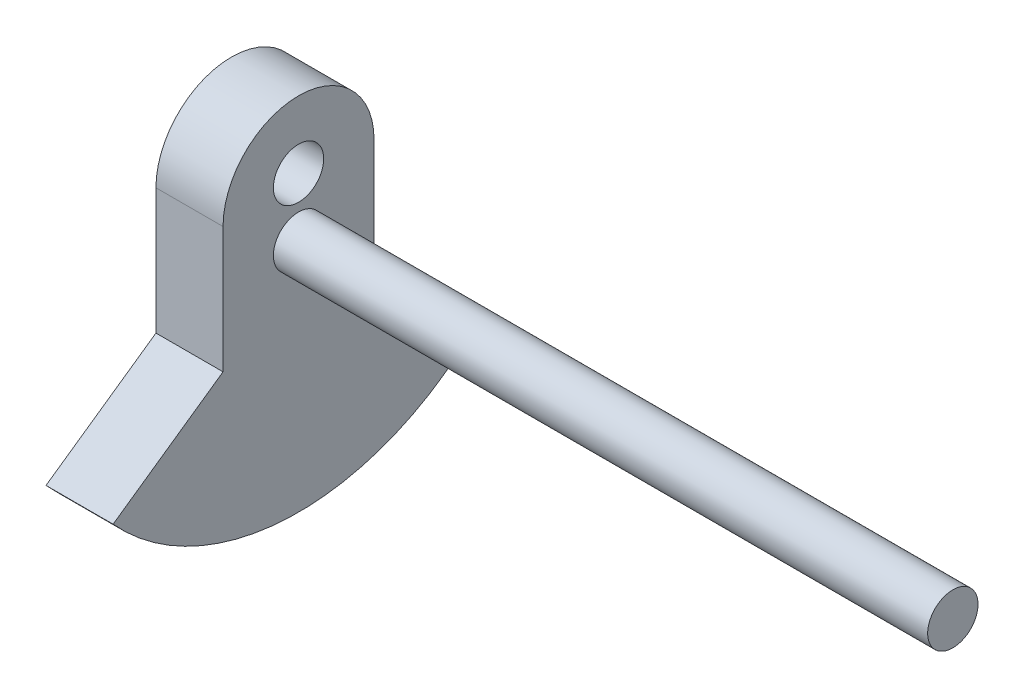
ISO-10303-21;
HEADER;
FILE_DESCRIPTION(('STEP AP214'),'2;1');
FILE_NAME('part.step','',(''),(''),'','','');
FILE_SCHEMA(('AUTOMOTIVE_DESIGN { 1 0 10303 214 1 1 1 1 }'));
ENDSEC;
DATA;
#1=APPLICATION_CONTEXT('core data for automotive mechanical design processes');
#2=APPLICATION_PROTOCOL_DEFINITION('international standard','automotive_design',2000,#1);
#3=PRODUCT_CONTEXT('',#1,'mechanical');
#4=PRODUCT('Part','Part','',(#3));
#5=PRODUCT_RELATED_PRODUCT_CATEGORY('part','',(#4));
#6=PRODUCT_DEFINITION_FORMATION('','',#4);
#7=PRODUCT_DEFINITION_CONTEXT('part definition',#1,'design');
#8=PRODUCT_DEFINITION('design','',#6,#7);
#9=PRODUCT_DEFINITION_SHAPE('','',#8);
#10=(LENGTH_UNIT() NAMED_UNIT(*) SI_UNIT(.MILLI.,.METRE.));
#11=(NAMED_UNIT(*) PLANE_ANGLE_UNIT() SI_UNIT($,.RADIAN.));
#12=(NAMED_UNIT(*) SI_UNIT($,.STERADIAN.) SOLID_ANGLE_UNIT());
#13=UNCERTAINTY_MEASURE_WITH_UNIT(LENGTH_MEASURE(1.E-05),#10,'distance_accuracy_value','');
#14=(GEOMETRIC_REPRESENTATION_CONTEXT(3) GLOBAL_UNCERTAINTY_ASSIGNED_CONTEXT((#13)) GLOBAL_UNIT_ASSIGNED_CONTEXT((#10,
#11,#12)) REPRESENTATION_CONTEXT('',''));
#15=CARTESIAN_POINT('',(0.,0.,0.));
#16=DIRECTION('',(0.,0.,1.));
#17=DIRECTION('',(1.,0.,0.));
#18=AXIS2_PLACEMENT_3D('',#15,#16,#17);
#19=CARTESIAN_POINT('',(4.,0.89347957198437,0.));
#20=DIRECTION('',(1.,0.,0.));
#21=DIRECTION('',(0.,0.,-1.));
#22=AXIS2_PLACEMENT_3D('',#19,#20,#21);
#23=PLANE('',#22);
#24=CARTESIAN_POINT('',(4.,3.5,0.));
#25=DIRECTION('',(1.,0.,0.));
#26=DIRECTION('',(0.,0.,-1.));
#27=AXIS2_PLACEMENT_3D('',#24,#25,#26);
#28=CIRCLE('',#27,1.5);
#29=CARTESIAN_POINT('',(4.,3.5,-1.5));
#30=VERTEX_POINT('',#29);
#31=EDGE_CURVE('E176',#30,#30,#28,.F.);
#32=ORIENTED_EDGE('',*,*,#31,.T.);
#33=EDGE_LOOP('',(#32));
#34=FACE_BOUND('',#33,.T.);
#35=CARTESIAN_POINT('',(4.,0.89347957198437,0.));
#36=DIRECTION('',(1.,0.,0.));
#37=DIRECTION('',(0.,0.,-1.));
#38=AXIS2_PLACEMENT_3D('',#35,#36,#37);
#39=CIRCLE('',#38,14.8934795719844);
#40=CARTESIAN_POINT('',(4.,-9.08861149080841,11.0532163543119));
#41=VERTEX_POINT('',#40);
#42=CARTESIAN_POINT('',(4.,-9.0886114908084,-11.0532163543119));
#43=VERTEX_POINT('',#42);
#44=EDGE_CURVE('E131',#41,#43,#39,.T.);
#45=ORIENTED_EDGE('',*,*,#44,.T.);
#46=DIRECTION('',(0.,0.57357643635105,0.819152044288989));
#47=VECTOR('',#46,1.);
#48=CARTESIAN_POINT('',(4.,-4.5,-4.5));
#49=LINE('',#48,#47);
#50=CARTESIAN_POINT('',(4.,-4.5,-4.5));
#51=VERTEX_POINT('',#50);
#52=EDGE_CURVE('E89',#43,#51,#49,.T.);
#53=ORIENTED_EDGE('',*,*,#52,.T.);
#54=DIRECTION('',(0.,1.,0.));
#55=VECTOR('',#54,1.);
#56=CARTESIAN_POINT('',(4.,-4.5,-4.5));
#57=LINE('',#56,#55);
#58=CARTESIAN_POINT('',(4.,3.,-4.5));
#59=VERTEX_POINT('',#58);
#60=EDGE_CURVE('E102',#51,#59,#57,.T.);
#61=ORIENTED_EDGE('',*,*,#60,.T.);
#62=CARTESIAN_POINT('',(4.,3.,0.));
#63=DIRECTION('',(1.,0.,0.));
#64=DIRECTION('',(0.,0.,1.));
#65=AXIS2_PLACEMENT_3D('',#62,#63,#64);
#66=CIRCLE('',#65,4.5);
#67=CARTESIAN_POINT('',(4.,3.,4.5));
#68=VERTEX_POINT('',#67);
#69=EDGE_CURVE('E96',#59,#68,#66,.T.);
#70=ORIENTED_EDGE('',*,*,#69,.T.);
#71=DIRECTION('',(0.,-1.,0.));
#72=VECTOR('',#71,1.);
#73=CARTESIAN_POINT('',(4.,-4.5,4.5));
#74=LINE('',#73,#72);
#75=CARTESIAN_POINT('',(4.,-4.5,4.5));
#76=VERTEX_POINT('',#75);
#77=EDGE_CURVE('E100',#68,#76,#74,.T.);
#78=ORIENTED_EDGE('',*,*,#77,.T.);
#79=DIRECTION('',(0.,-0.57357643635105,0.819152044288989));
#80=VECTOR('',#79,1.);
#81=CARTESIAN_POINT('',(4.,-4.5,4.5));
#82=LINE('',#81,#80);
#83=EDGE_CURVE('E52',#76,#41,#82,.T.);
#84=ORIENTED_EDGE('',*,*,#83,.T.);
#85=EDGE_LOOP('',(#45,#53,#61,#70,#78,#84));
#86=FACE_BOUND('',#85,.T.);
#87=CARTESIAN_POINT('',(4.,0.,0.));
#88=DIRECTION('',(1.,0.,0.));
#89=DIRECTION('',(0.,0.,-1.));
#90=AXIS2_PLACEMENT_3D('',#87,#88,#89);
#91=CIRCLE('',#90,1.5);
#92=CARTESIAN_POINT('',(4.,0.,-1.5));
#93=VERTEX_POINT('',#92);
#94=EDGE_CURVE('E124',#93,#93,#91,.T.);
#95=ORIENTED_EDGE('',*,*,#94,.F.);
#96=EDGE_LOOP('',(#95));
#97=FACE_BOUND('',#96,.T.);
#98=ADVANCED_FACE('F35',(#34,#86,#97),#23,.T.);
#99=CARTESIAN_POINT('',(0.,0.89347957198437,0.));
#100=DIRECTION('',(1.,0.,0.));
#101=DIRECTION('',(0.,0.,-1.));
#102=AXIS2_PLACEMENT_3D('',#99,#100,#101);
#103=PLANE('',#102);
#104=CARTESIAN_POINT('',(0.,3.5,0.));
#105=DIRECTION('',(-1.,0.,0.));
#106=DIRECTION('',(0.,0.,1.));
#107=AXIS2_PLACEMENT_3D('',#104,#105,#106);
#108=CIRCLE('',#107,1.5);
#109=CARTESIAN_POINT('',(0.,3.5,1.5));
#110=VERTEX_POINT('',#109);
#111=EDGE_CURVE('E179',#110,#110,#108,.T.);
#112=ORIENTED_EDGE('',*,*,#111,.F.);
#113=EDGE_LOOP('',(#112));
#114=FACE_BOUND('',#113,.T.);
#115=CARTESIAN_POINT('',(0.,0.89347957198437,0.));
#116=DIRECTION('',(1.,0.,0.));
#117=DIRECTION('',(0.,0.,-1.));
#118=AXIS2_PLACEMENT_3D('',#115,#116,#117);
#119=CIRCLE('',#118,14.8934795719844);
#120=CARTESIAN_POINT('',(0.,-9.08861149080841,11.0532163543119));
#121=VERTEX_POINT('',#120);
#122=CARTESIAN_POINT('',(0.,-9.0886114908084,-11.0532163543119));
#123=VERTEX_POINT('',#122);
#124=EDGE_CURVE('E120',#121,#123,#119,.T.);
#125=ORIENTED_EDGE('',*,*,#124,.F.);
#126=DIRECTION('',(0.,-0.57357643635105,0.819152044288989));
#127=VECTOR('',#126,1.);
#128=CARTESIAN_POINT('',(0.,-4.5,4.5));
#129=LINE('',#128,#127);
#130=CARTESIAN_POINT('',(0.,-4.5,4.5));
#131=VERTEX_POINT('',#130);
#132=EDGE_CURVE('E81',#131,#121,#129,.T.);
#133=ORIENTED_EDGE('',*,*,#132,.F.);
#134=DIRECTION('',(0.,-1.,0.));
#135=VECTOR('',#134,1.);
#136=CARTESIAN_POINT('',(0.,-4.5,4.5));
#137=LINE('',#136,#135);
#138=CARTESIAN_POINT('',(0.,3.,4.5));
#139=VERTEX_POINT('',#138);
#140=EDGE_CURVE('E75',#139,#131,#137,.T.);
#141=ORIENTED_EDGE('',*,*,#140,.F.);
#142=CARTESIAN_POINT('',(0.,3.,0.));
#143=DIRECTION('',(1.,0.,0.));
#144=DIRECTION('',(0.,0.,1.));
#145=AXIS2_PLACEMENT_3D('',#142,#143,#144);
#146=CIRCLE('',#145,4.5);
#147=CARTESIAN_POINT('',(0.,3.,-4.5));
#148=VERTEX_POINT('',#147);
#149=EDGE_CURVE('E110',#148,#139,#146,.T.);
#150=ORIENTED_EDGE('',*,*,#149,.F.);
#151=DIRECTION('',(0.,1.,0.));
#152=VECTOR('',#151,1.);
#153=CARTESIAN_POINT('',(0.,-4.5,-4.5));
#154=LINE('',#153,#152);
#155=CARTESIAN_POINT('',(0.,-4.5,-4.5));
#156=VERTEX_POINT('',#155);
#157=EDGE_CURVE('E126',#156,#148,#154,.T.);
#158=ORIENTED_EDGE('',*,*,#157,.F.);
#159=DIRECTION('',(0.,0.57357643635105,0.819152044288989));
#160=VECTOR('',#159,1.);
#161=CARTESIAN_POINT('',(0.,-4.5,-4.5));
#162=LINE('',#161,#160);
#163=EDGE_CURVE('E123',#123,#156,#162,.T.);
#164=ORIENTED_EDGE('',*,*,#163,.F.);
#165=EDGE_LOOP('',(#125,#133,#141,#150,#158,#164));
#166=FACE_BOUND('',#165,.T.);
#167=ADVANCED_FACE('F140',(#114,#166),#103,.F.);
#168=CARTESIAN_POINT('',(4.,0.89347957198437,0.));
#169=DIRECTION('',(-1.,0.,0.));
#170=DIRECTION('',(0.,0.,1.));
#171=AXIS2_PLACEMENT_3D('',#168,#169,#170);
#172=CYLINDRICAL_SURFACE('',#171,14.8934795719844);
#173=ORIENTED_EDGE('',*,*,#124,.T.);
#174=DIRECTION('',(-1.,0.,0.));
#175=VECTOR('',#174,1.);
#176=CARTESIAN_POINT('',(4.,-9.0886114908084,-11.0532163543119));
#177=LINE('',#176,#175);
#178=EDGE_CURVE('E11',#43,#123,#177,.T.);
#179=ORIENTED_EDGE('',*,*,#178,.F.);
#180=ORIENTED_EDGE('',*,*,#44,.F.);
#181=DIRECTION('',(-1.,0.,0.));
#182=VECTOR('',#181,1.);
#183=CARTESIAN_POINT('',(4.,-9.08861149080841,11.0532163543119));
#184=LINE('',#183,#182);
#185=EDGE_CURVE('E116',#41,#121,#184,.T.);
#186=ORIENTED_EDGE('',*,*,#185,.T.);
#187=EDGE_LOOP('',(#173,#179,#180,#186));
#188=FACE_BOUND('',#187,.T.);
#189=ADVANCED_FACE('F37',(#188),#172,.T.);
#190=CARTESIAN_POINT('',(4.,-4.5,-4.5));
#191=DIRECTION('',(0.,-0.819152044288989,0.57357643635105));
#192=DIRECTION('',(0.,-0.57357643635105,-0.819152044288989));
#193=AXIS2_PLACEMENT_3D('',#190,#191,#192);
#194=PLANE('',#193);
#195=ORIENTED_EDGE('',*,*,#163,.T.);
#196=DIRECTION('',(-1.,0.,0.));
#197=VECTOR('',#196,1.);
#198=CARTESIAN_POINT('',(4.,-4.5,-4.5));
#199=LINE('',#198,#197);
#200=EDGE_CURVE('E44',#51,#156,#199,.T.);
#201=ORIENTED_EDGE('',*,*,#200,.F.);
#202=ORIENTED_EDGE('',*,*,#52,.F.);
#203=ORIENTED_EDGE('',*,*,#178,.T.);
#204=EDGE_LOOP('',(#195,#201,#202,#203));
#205=FACE_BOUND('',#204,.T.);
#206=ADVANCED_FACE('F229',(#205),#194,.F.);
#207=CARTESIAN_POINT('',(4.,-4.5,-4.5));
#208=DIRECTION('',(0.,0.,1.));
#209=DIRECTION('',(0.,-1.,0.));
#210=AXIS2_PLACEMENT_3D('',#207,#208,#209);
#211=PLANE('',#210);
#212=ORIENTED_EDGE('',*,*,#157,.T.);
#213=DIRECTION('',(-1.,0.,0.));
#214=VECTOR('',#213,1.);
#215=CARTESIAN_POINT('',(4.,3.,-4.5));
#216=LINE('',#215,#214);
#217=EDGE_CURVE('E111',#59,#148,#216,.T.);
#218=ORIENTED_EDGE('',*,*,#217,.F.);
#219=ORIENTED_EDGE('',*,*,#60,.F.);
#220=ORIENTED_EDGE('',*,*,#200,.T.);
#221=EDGE_LOOP('',(#212,#218,#219,#220));
#222=FACE_BOUND('',#221,.T.);
#223=ADVANCED_FACE('F137',(#222),#211,.F.);
#224=CARTESIAN_POINT('',(4.,3.,0.));
#225=DIRECTION('',(-1.,0.,0.));
#226=DIRECTION('',(0.,0.,1.));
#227=AXIS2_PLACEMENT_3D('',#224,#225,#226);
#228=CYLINDRICAL_SURFACE('',#227,4.5);
#229=ORIENTED_EDGE('',*,*,#149,.T.);
#230=DIRECTION('',(-1.,0.,0.));
#231=VECTOR('',#230,1.);
#232=CARTESIAN_POINT('',(4.,3.,4.5));
#233=LINE('',#232,#231);
#234=EDGE_CURVE('E107',#68,#139,#233,.T.);
#235=ORIENTED_EDGE('',*,*,#234,.F.);
#236=ORIENTED_EDGE('',*,*,#69,.F.);
#237=ORIENTED_EDGE('',*,*,#217,.T.);
#238=EDGE_LOOP('',(#229,#235,#236,#237));
#239=FACE_BOUND('',#238,.T.);
#240=ADVANCED_FACE('F108',(#239),#228,.T.);
#241=CARTESIAN_POINT('',(4.,-4.5,4.5));
#242=DIRECTION('',(0.,0.,-1.));
#243=DIRECTION('',(0.,1.,0.));
#244=AXIS2_PLACEMENT_3D('',#241,#242,#243);
#245=PLANE('',#244);
#246=ORIENTED_EDGE('',*,*,#140,.T.);
#247=DIRECTION('',(-1.,0.,0.));
#248=VECTOR('',#247,1.);
#249=CARTESIAN_POINT('',(4.,-4.5,4.5));
#250=LINE('',#249,#248);
#251=EDGE_CURVE('E112',#76,#131,#250,.T.);
#252=ORIENTED_EDGE('',*,*,#251,.F.);
#253=ORIENTED_EDGE('',*,*,#77,.F.);
#254=ORIENTED_EDGE('',*,*,#234,.T.);
#255=EDGE_LOOP('',(#246,#252,#253,#254));
#256=FACE_BOUND('',#255,.T.);
#257=ADVANCED_FACE('F114',(#256),#245,.F.);
#258=CARTESIAN_POINT('',(4.,-4.5,4.5));
#259=DIRECTION('',(0.,-0.819152044288989,-0.57357643635105));
#260=DIRECTION('',(0.,0.57357643635105,-0.819152044288989));
#261=AXIS2_PLACEMENT_3D('',#258,#259,#260);
#262=PLANE('',#261);
#263=ORIENTED_EDGE('',*,*,#132,.T.);
#264=ORIENTED_EDGE('',*,*,#185,.F.);
#265=ORIENTED_EDGE('',*,*,#83,.F.);
#266=ORIENTED_EDGE('',*,*,#251,.T.);
#267=EDGE_LOOP('',(#263,#264,#265,#266));
#268=FACE_BOUND('',#267,.T.);
#269=ADVANCED_FACE('F144',(#268),#262,.F.);
#270=CARTESIAN_POINT('',(43.,0.,0.));
#271=DIRECTION('',(-1.,0.,0.));
#272=DIRECTION('',(0.,0.,1.));
#273=AXIS2_PLACEMENT_3D('',#270,#271,#272);
#274=CYLINDRICAL_SURFACE('',#273,1.5);
#275=ORIENTED_EDGE('',*,*,#94,.T.);
#276=EDGE_LOOP('',(#275));
#277=FACE_BOUND('',#276,.T.);
#278=CARTESIAN_POINT('',(43.,0.,0.));
#279=DIRECTION('',(1.,0.,0.));
#280=DIRECTION('',(0.,0.,-1.));
#281=AXIS2_PLACEMENT_3D('',#278,#279,#280);
#282=CIRCLE('',#281,1.5);
#283=CARTESIAN_POINT('',(43.,0.,-1.5));
#284=VERTEX_POINT('',#283);
#285=EDGE_CURVE('E180',#284,#284,#282,.T.);
#286=ORIENTED_EDGE('',*,*,#285,.F.);
#287=EDGE_LOOP('',(#286));
#288=FACE_BOUND('',#287,.T.);
#289=ADVANCED_FACE('F146',(#277,#288),#274,.T.);
#290=CARTESIAN_POINT('',(43.,-4.58121654747046,-23.2618423188195));
#291=DIRECTION('',(1.,0.,0.));
#292=DIRECTION('',(0.,0.,-1.));
#293=AXIS2_PLACEMENT_3D('',#290,#291,#292);
#294=PLANE('',#293);
#295=ORIENTED_EDGE('',*,*,#285,.T.);
#296=EDGE_LOOP('',(#295));
#297=FACE_BOUND('',#296,.T.);
#298=ADVANCED_FACE('F152',(#297),#294,.T.);
#299=CARTESIAN_POINT('',(43.001,3.5,0.));
#300=DIRECTION('',(-1.,0.,0.));
#301=DIRECTION('',(0.,0.,1.));
#302=AXIS2_PLACEMENT_3D('',#299,#300,#301);
#303=CYLINDRICAL_SURFACE('',#302,1.5);
#304=ORIENTED_EDGE('',*,*,#31,.F.);
#305=EDGE_LOOP('',(#304));
#306=FACE_BOUND('',#305,.T.);
#307=ORIENTED_EDGE('',*,*,#111,.T.);
#308=EDGE_LOOP('',(#307));
#309=FACE_BOUND('',#308,.T.);
#310=ADVANCED_FACE('F168',(#306,#309),#303,.F.);
#311=CLOSED_SHELL('',(#98,#167,#189,#206,#223,#240,#257,#269,#289,#298,#310));
#312=MANIFOLD_SOLID_BREP('B2',#311);
#313=ADVANCED_BREP_SHAPE_REPRESENTATION('',(#18,#312),#14);
#314=SHAPE_DEFINITION_REPRESENTATION(#9,#313);
ENDSEC;
END-ISO-10303-21;
